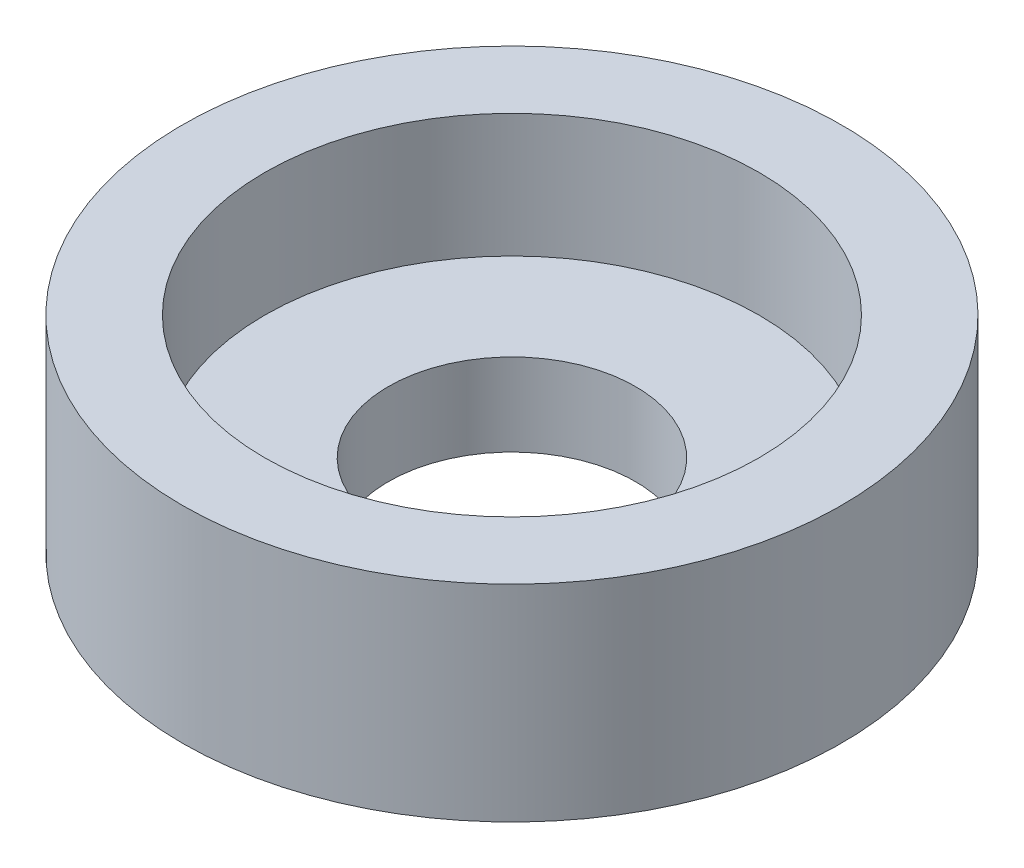
ISO-10303-21;
HEADER;
FILE_DESCRIPTION(('STEP AP214'),'2;1');
FILE_NAME('part.step','',(''),(''),'','','');
FILE_SCHEMA(('AUTOMOTIVE_DESIGN { 1 0 10303 214 1 1 1 1 }'));
ENDSEC;
DATA;
#1=APPLICATION_CONTEXT('core data for automotive mechanical design processes');
#2=APPLICATION_PROTOCOL_DEFINITION('international standard','automotive_design',2000,#1);
#3=PRODUCT_CONTEXT('',#1,'mechanical');
#4=PRODUCT('Part','Part','',(#3));
#5=PRODUCT_RELATED_PRODUCT_CATEGORY('part','',(#4));
#6=PRODUCT_DEFINITION_FORMATION('','',#4);
#7=PRODUCT_DEFINITION_CONTEXT('part definition',#1,'design');
#8=PRODUCT_DEFINITION('design','',#6,#7);
#9=PRODUCT_DEFINITION_SHAPE('','',#8);
#10=(LENGTH_UNIT() NAMED_UNIT(*) SI_UNIT(.MILLI.,.METRE.));
#11=(NAMED_UNIT(*) PLANE_ANGLE_UNIT() SI_UNIT($,.RADIAN.));
#12=(NAMED_UNIT(*) SI_UNIT($,.STERADIAN.) SOLID_ANGLE_UNIT());
#13=UNCERTAINTY_MEASURE_WITH_UNIT(LENGTH_MEASURE(1.E-05),#10,'distance_accuracy_value','');
#14=(GEOMETRIC_REPRESENTATION_CONTEXT(3) GLOBAL_UNCERTAINTY_ASSIGNED_CONTEXT((#13)) GLOBAL_UNIT_ASSIGNED_CONTEXT((#10,
#11,#12)) REPRESENTATION_CONTEXT('',''));
#15=CARTESIAN_POINT('',(0.,0.,0.));
#16=DIRECTION('',(0.,0.,1.));
#17=DIRECTION('',(1.,0.,0.));
#18=AXIS2_PLACEMENT_3D('',#15,#16,#17);
#19=CARTESIAN_POINT('',(0.,5.,0.));
#20=DIRECTION('',(0.,-1.,0.));
#21=DIRECTION('',(0.,0.,-1.));
#22=AXIS2_PLACEMENT_3D('',#19,#20,#21);
#23=CYLINDRICAL_SURFACE('',#22,8.);
#24=CARTESIAN_POINT('',(0.,5.,0.));
#25=DIRECTION('',(0.,1.,0.));
#26=DIRECTION('',(0.,0.,1.));
#27=AXIS2_PLACEMENT_3D('',#24,#25,#26);
#28=CIRCLE('',#27,8.);
#29=CARTESIAN_POINT('',(0.,5.,8.));
#30=VERTEX_POINT('',#29);
#31=EDGE_CURVE('E11',#30,#30,#28,.T.);
#32=ORIENTED_EDGE('',*,*,#31,.F.);
#33=EDGE_LOOP('',(#32));
#34=FACE_BOUND('',#33,.T.);
#35=CARTESIAN_POINT('',(0.,0.,0.));
#36=DIRECTION('',(0.,1.,0.));
#37=DIRECTION('',(0.,0.,1.));
#38=AXIS2_PLACEMENT_3D('',#35,#36,#37);
#39=CIRCLE('',#38,8.);
#40=CARTESIAN_POINT('',(0.,0.,8.));
#41=VERTEX_POINT('',#40);
#42=EDGE_CURVE('E38',#41,#41,#39,.T.);
#43=ORIENTED_EDGE('',*,*,#42,.T.);
#44=EDGE_LOOP('',(#43));
#45=FACE_BOUND('',#44,.T.);
#46=ADVANCED_FACE('F35',(#34,#45),#23,.T.);
#47=CARTESIAN_POINT('',(0.,5.,0.));
#48=DIRECTION('',(0.,1.,0.));
#49=DIRECTION('',(0.,0.,1.));
#50=AXIS2_PLACEMENT_3D('',#47,#48,#49);
#51=PLANE('',#50);
#52=CARTESIAN_POINT('',(0.,5.,0.));
#53=DIRECTION('',(0.,1.,0.));
#54=DIRECTION('',(0.,0.,1.));
#55=AXIS2_PLACEMENT_3D('',#52,#53,#54);
#56=CIRCLE('',#55,6.);
#57=CARTESIAN_POINT('',(0.,5.,6.));
#58=VERTEX_POINT('',#57);
#59=EDGE_CURVE('E49',#58,#58,#56,.T.);
#60=ORIENTED_EDGE('',*,*,#59,.F.);
#61=EDGE_LOOP('',(#60));
#62=FACE_BOUND('',#61,.T.);
#63=ORIENTED_EDGE('',*,*,#31,.T.);
#64=EDGE_LOOP('',(#63));
#65=FACE_BOUND('',#64,.T.);
#66=ADVANCED_FACE('F80',(#62,#65),#51,.T.);
#67=CARTESIAN_POINT('',(0.,0.,0.));
#68=DIRECTION('',(0.,1.,0.));
#69=DIRECTION('',(0.,0.,1.));
#70=AXIS2_PLACEMENT_3D('',#67,#68,#69);
#71=PLANE('',#70);
#72=CARTESIAN_POINT('',(0.,0.,0.));
#73=DIRECTION('',(0.,1.,0.));
#74=DIRECTION('',(0.,0.,1.));
#75=AXIS2_PLACEMENT_3D('',#72,#73,#74);
#76=CIRCLE('',#75,3.);
#77=CARTESIAN_POINT('',(0.,0.,3.));
#78=VERTEX_POINT('',#77);
#79=EDGE_CURVE('E52',#78,#78,#76,.T.);
#80=ORIENTED_EDGE('',*,*,#79,.T.);
#81=EDGE_LOOP('',(#80));
#82=FACE_BOUND('',#81,.T.);
#83=ORIENTED_EDGE('',*,*,#42,.F.);
#84=EDGE_LOOP('',(#83));
#85=FACE_BOUND('',#84,.T.);
#86=ADVANCED_FACE('F59',(#82,#85),#71,.F.);
#87=CARTESIAN_POINT('',(0.,-16.9705627484771,0.));
#88=DIRECTION('',(0.,1.,0.));
#89=DIRECTION('',(0.,0.,1.));
#90=AXIS2_PLACEMENT_3D('',#87,#88,#89);
#91=CYLINDRICAL_SURFACE('',#90,6.);
#92=CARTESIAN_POINT('',(0.,2.,0.));
#93=DIRECTION('',(0.,1.,0.));
#94=DIRECTION('',(0.,0.,1.));
#95=AXIS2_PLACEMENT_3D('',#92,#93,#94);
#96=CIRCLE('',#95,6.);
#97=CARTESIAN_POINT('',(0.,2.,6.));
#98=VERTEX_POINT('',#97);
#99=EDGE_CURVE('E45',#98,#98,#96,.F.);
#100=ORIENTED_EDGE('',*,*,#99,.T.);
#101=EDGE_LOOP('',(#100));
#102=FACE_BOUND('',#101,.T.);
#103=ORIENTED_EDGE('',*,*,#59,.T.);
#104=EDGE_LOOP('',(#103));
#105=FACE_BOUND('',#104,.T.);
#106=ADVANCED_FACE('F71',(#102,#105),#91,.F.);
#107=CARTESIAN_POINT('',(0.,2.,0.));
#108=DIRECTION('',(0.,1.,0.));
#109=DIRECTION('',(0.,0.,1.));
#110=AXIS2_PLACEMENT_3D('',#107,#108,#109);
#111=PLANE('',#110);
#112=CARTESIAN_POINT('',(0.,2.,0.));
#113=DIRECTION('',(0.,1.,0.));
#114=DIRECTION('',(0.,0.,1.));
#115=AXIS2_PLACEMENT_3D('',#112,#113,#114);
#116=CIRCLE('',#115,3.);
#117=CARTESIAN_POINT('',(0.,2.,3.));
#118=VERTEX_POINT('',#117);
#119=EDGE_CURVE('E53',#118,#118,#116,.T.);
#120=ORIENTED_EDGE('',*,*,#119,.F.);
#121=EDGE_LOOP('',(#120));
#122=FACE_BOUND('',#121,.T.);
#123=ORIENTED_EDGE('',*,*,#99,.F.);
#124=EDGE_LOOP('',(#123));
#125=FACE_BOUND('',#124,.T.);
#126=ADVANCED_FACE('F65',(#122,#125),#111,.T.);
#127=CARTESIAN_POINT('',(0.,0.,0.));
#128=DIRECTION('',(0.,1.,0.));
#129=DIRECTION('',(0.,0.,1.));
#130=AXIS2_PLACEMENT_3D('',#127,#128,#129);
#131=CYLINDRICAL_SURFACE('',#130,3.);
#132=ORIENTED_EDGE('',*,*,#79,.F.);
#133=EDGE_LOOP('',(#132));
#134=FACE_BOUND('',#133,.T.);
#135=ORIENTED_EDGE('',*,*,#119,.T.);
#136=EDGE_LOOP('',(#135));
#137=FACE_BOUND('',#136,.T.);
#138=ADVANCED_FACE('F62',(#134,#137),#131,.F.);
#139=CLOSED_SHELL('',(#46,#66,#86,#106,#126,#138));
#140=MANIFOLD_SOLID_BREP('B2',#139);
#141=ADVANCED_BREP_SHAPE_REPRESENTATION('',(#18,#140),#14);
#142=SHAPE_DEFINITION_REPRESENTATION(#9,#141);
ENDSEC;
END-ISO-10303-21;
